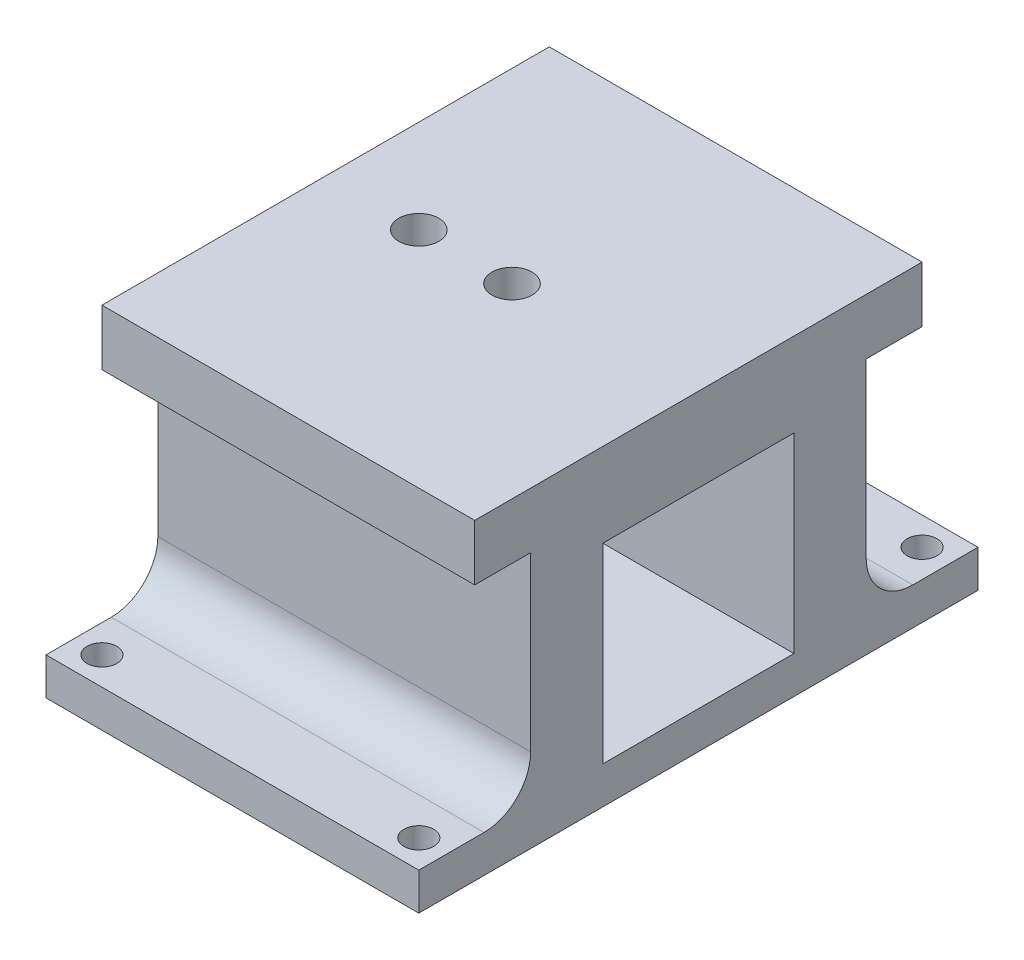
ISO-10303-21;
HEADER;
FILE_DESCRIPTION(('STEP AP214'),'2;1');
FILE_NAME('part.step','',(''),(''),'','','');
FILE_SCHEMA(('AUTOMOTIVE_DESIGN { 1 0 10303 214 1 1 1 1 }'));
ENDSEC;
DATA;
#1=APPLICATION_CONTEXT('core data for automotive mechanical design processes');
#2=APPLICATION_PROTOCOL_DEFINITION('international standard','automotive_design',2000,#1);
#3=PRODUCT_CONTEXT('',#1,'mechanical');
#4=PRODUCT('Part','Part','',(#3));
#5=PRODUCT_RELATED_PRODUCT_CATEGORY('part','',(#4));
#6=PRODUCT_DEFINITION_FORMATION('','',#4);
#7=PRODUCT_DEFINITION_CONTEXT('part definition',#1,'design');
#8=PRODUCT_DEFINITION('design','',#6,#7);
#9=PRODUCT_DEFINITION_SHAPE('','',#8);
#10=(LENGTH_UNIT() NAMED_UNIT(*) SI_UNIT(.MILLI.,.METRE.));
#11=(NAMED_UNIT(*) PLANE_ANGLE_UNIT() SI_UNIT($,.RADIAN.));
#12=(NAMED_UNIT(*) SI_UNIT($,.STERADIAN.) SOLID_ANGLE_UNIT());
#13=UNCERTAINTY_MEASURE_WITH_UNIT(LENGTH_MEASURE(1.E-05),#10,'distance_accuracy_value','');
#14=(GEOMETRIC_REPRESENTATION_CONTEXT(3) GLOBAL_UNCERTAINTY_ASSIGNED_CONTEXT((#13)) GLOBAL_UNIT_ASSIGNED_CONTEXT((#10,
#11,#12)) REPRESENTATION_CONTEXT('',''));
#15=CARTESIAN_POINT('',(0.,0.,0.));
#16=DIRECTION('',(0.,0.,1.));
#17=DIRECTION('',(1.,0.,0.));
#18=AXIS2_PLACEMENT_3D('',#15,#16,#17);
#19=CARTESIAN_POINT('',(0.,4.,0.));
#20=DIRECTION('',(0.,1.,0.));
#21=DIRECTION('',(0.,0.,1.));
#22=AXIS2_PLACEMENT_3D('',#19,#20,#21);
#23=PLANE('',#22);
#24=CARTESIAN_POINT('',(16.9999999999998,4.,-27.));
#25=DIRECTION('',(0.,1.,0.));
#26=DIRECTION('',(0.,0.,1.));
#27=AXIS2_PLACEMENT_3D('',#24,#25,#26);
#28=CIRCLE('',#27,1.60000000000001);
#29=CARTESIAN_POINT('',(16.9999999999998,4.,-25.4));
#30=VERTEX_POINT('',#29);
#31=EDGE_CURVE('E226',#30,#30,#28,.F.);
#32=ORIENTED_EDGE('',*,*,#31,.T.);
#33=EDGE_LOOP('',(#32));
#34=FACE_BOUND('',#33,.T.);
#35=DIRECTION('',(0.,0.,-1.));
#36=VECTOR('',#35,1.);
#37=CARTESIAN_POINT('',(-20.,4.,0.));
#38=LINE('',#37,#36);
#39=CARTESIAN_POINT('',(-20.,4.,-23.));
#40=VERTEX_POINT('',#39);
#41=CARTESIAN_POINT('',(-20.,4.,-30.));
#42=VERTEX_POINT('',#41);
#43=EDGE_CURVE('E375',#40,#42,#38,.T.);
#44=ORIENTED_EDGE('',*,*,#43,.F.);
#45=DIRECTION('',(-1.,0.,0.));
#46=VECTOR('',#45,1.);
#47=CARTESIAN_POINT('',(0.,4.,-23.));
#48=LINE('',#47,#46);
#49=CARTESIAN_POINT('',(20.,4.,-23.));
#50=VERTEX_POINT('',#49);
#51=EDGE_CURVE('E389',#40,#50,#48,.F.);
#52=ORIENTED_EDGE('',*,*,#51,.T.);
#53=DIRECTION('',(0.,0.,-1.));
#54=VECTOR('',#53,1.);
#55=CARTESIAN_POINT('',(20.,4.,0.));
#56=LINE('',#55,#54);
#57=CARTESIAN_POINT('',(20.,4.,-30.));
#58=VERTEX_POINT('',#57);
#59=EDGE_CURVE('E377',#50,#58,#56,.T.);
#60=ORIENTED_EDGE('',*,*,#59,.T.);
#61=DIRECTION('',(1.,0.,0.));
#62=VECTOR('',#61,1.);
#63=CARTESIAN_POINT('',(-20.,4.,-30.));
#64=LINE('',#63,#62);
#65=EDGE_CURVE('E258',#42,#58,#64,.T.);
#66=ORIENTED_EDGE('',*,*,#65,.F.);
#67=EDGE_LOOP('',(#44,#52,#60,#66));
#68=FACE_BOUND('',#67,.T.);
#69=CARTESIAN_POINT('',(-17.,4.,-27.));
#70=DIRECTION('',(0.,1.,0.));
#71=DIRECTION('',(0.,0.,1.));
#72=AXIS2_PLACEMENT_3D('',#69,#70,#71);
#73=CIRCLE('',#72,1.6);
#74=CARTESIAN_POINT('',(-17.,4.,-25.4));
#75=VERTEX_POINT('',#74);
#76=EDGE_CURVE('E239',#75,#75,#73,.T.);
#77=ORIENTED_EDGE('',*,*,#76,.F.);
#78=EDGE_LOOP('',(#77));
#79=FACE_BOUND('',#78,.T.);
#80=ADVANCED_FACE('F56',(#34,#68,#79),#23,.T.);
#81=CARTESIAN_POINT('',(-17.,4.,27.));
#82=DIRECTION('',(0.,1.,0.));
#83=DIRECTION('',(0.,0.,1.));
#84=AXIS2_PLACEMENT_3D('',#81,#82,#83);
#85=CIRCLE('',#84,1.6);
#86=CARTESIAN_POINT('',(-17.,4.,28.6));
#87=VERTEX_POINT('',#86);
#88=EDGE_CURVE('E222',#87,#87,#85,.F.);
#89=ORIENTED_EDGE('',*,*,#88,.T.);
#90=EDGE_LOOP('',(#89));
#91=FACE_BOUND('',#90,.T.);
#92=CARTESIAN_POINT('',(20.,4.,30.));
#93=VERTEX_POINT('',#92);
#94=CARTESIAN_POINT('',(20.,4.,23.));
#95=VERTEX_POINT('',#94);
#96=EDGE_CURVE('E372',#93,#95,#56,.T.);
#97=ORIENTED_EDGE('',*,*,#96,.T.);
#98=DIRECTION('',(1.,0.,0.));
#99=VECTOR('',#98,1.);
#100=CARTESIAN_POINT('',(0.,4.,23.));
#101=LINE('',#100,#99);
#102=CARTESIAN_POINT('',(-20.,4.,23.));
#103=VERTEX_POINT('',#102);
#104=EDGE_CURVE('E78',#95,#103,#101,.F.);
#105=ORIENTED_EDGE('',*,*,#104,.T.);
#106=CARTESIAN_POINT('',(-20.,4.,30.));
#107=VERTEX_POINT('',#106);
#108=EDGE_CURVE('E358',#107,#103,#38,.T.);
#109=ORIENTED_EDGE('',*,*,#108,.F.);
#110=DIRECTION('',(-1.,0.,0.));
#111=VECTOR('',#110,1.);
#112=CARTESIAN_POINT('',(-20.,4.,30.));
#113=LINE('',#112,#111);
#114=EDGE_CURVE('E254',#93,#107,#113,.T.);
#115=ORIENTED_EDGE('',*,*,#114,.F.);
#116=EDGE_LOOP('',(#97,#105,#109,#115));
#117=FACE_BOUND('',#116,.T.);
#118=CARTESIAN_POINT('',(16.9999999999998,4.,27.));
#119=DIRECTION('',(0.,1.,0.));
#120=DIRECTION('',(0.,0.,1.));
#121=AXIS2_PLACEMENT_3D('',#118,#119,#120);
#122=CIRCLE('',#121,1.60000000000001);
#123=CARTESIAN_POINT('',(16.9999999999998,4.,28.6));
#124=VERTEX_POINT('',#123);
#125=EDGE_CURVE('E231',#124,#124,#122,.T.);
#126=ORIENTED_EDGE('',*,*,#125,.F.);
#127=EDGE_LOOP('',(#126));
#128=FACE_BOUND('',#127,.T.);
#129=ADVANCED_FACE('F446',(#91,#117,#128),#23,.T.);
#130=CARTESIAN_POINT('',(0.,0.,0.));
#131=DIRECTION('',(0.,1.,0.));
#132=DIRECTION('',(0.,0.,1.));
#133=AXIS2_PLACEMENT_3D('',#130,#131,#132);
#134=PLANE('',#133);
#135=CARTESIAN_POINT('',(0.,0.,0.));
#136=DIRECTION('',(0.,1.,0.));
#137=DIRECTION('',(0.,0.,1.));
#138=AXIS2_PLACEMENT_3D('',#135,#136,#137);
#139=CIRCLE('',#138,2.15);
#140=CARTESIAN_POINT('',(0.,0.,2.15));
#141=VERTEX_POINT('',#140);
#142=EDGE_CURVE('E580',#141,#141,#139,.T.);
#143=ORIENTED_EDGE('',*,*,#142,.T.);
#144=EDGE_LOOP('',(#143));
#145=FACE_BOUND('',#144,.T.);
#146=CARTESIAN_POINT('',(-10.,0.,0.));
#147=DIRECTION('',(0.,1.,0.));
#148=DIRECTION('',(0.,0.,1.));
#149=AXIS2_PLACEMENT_3D('',#146,#147,#148);
#150=CIRCLE('',#149,2.15);
#151=CARTESIAN_POINT('',(-10.,0.,2.15));
#152=VERTEX_POINT('',#151);
#153=EDGE_CURVE('E581',#152,#152,#150,.T.);
#154=ORIENTED_EDGE('',*,*,#153,.T.);
#155=EDGE_LOOP('',(#154));
#156=FACE_BOUND('',#155,.T.);
#157=CARTESIAN_POINT('',(16.9999999999998,0.,27.));
#158=DIRECTION('',(0.,1.,0.));
#159=DIRECTION('',(0.,0.,1.));
#160=AXIS2_PLACEMENT_3D('',#157,#158,#159);
#161=CIRCLE('',#160,1.60000000000001);
#162=CARTESIAN_POINT('',(16.9999999999998,0.,28.6));
#163=VERTEX_POINT('',#162);
#164=EDGE_CURVE('E235',#163,#163,#161,.T.);
#165=ORIENTED_EDGE('',*,*,#164,.T.);
#166=EDGE_LOOP('',(#165));
#167=FACE_BOUND('',#166,.T.);
#168=CARTESIAN_POINT('',(-17.,0.,27.));
#169=DIRECTION('',(0.,1.,0.));
#170=DIRECTION('',(0.,0.,1.));
#171=AXIS2_PLACEMENT_3D('',#168,#169,#170);
#172=CIRCLE('',#171,1.6);
#173=CARTESIAN_POINT('',(-17.,0.,28.6));
#174=VERTEX_POINT('',#173);
#175=EDGE_CURVE('E227',#174,#174,#172,.F.);
#176=ORIENTED_EDGE('',*,*,#175,.F.);
#177=EDGE_LOOP('',(#176));
#178=FACE_BOUND('',#177,.T.);
#179=CARTESIAN_POINT('',(16.9999999999998,0.,-27.));
#180=DIRECTION('',(0.,1.,0.));
#181=DIRECTION('',(0.,0.,1.));
#182=AXIS2_PLACEMENT_3D('',#179,#180,#181);
#183=CIRCLE('',#182,1.60000000000001);
#184=CARTESIAN_POINT('',(16.9999999999998,0.,-25.4));
#185=VERTEX_POINT('',#184);
#186=EDGE_CURVE('E246',#185,#185,#183,.F.);
#187=ORIENTED_EDGE('',*,*,#186,.F.);
#188=EDGE_LOOP('',(#187));
#189=FACE_BOUND('',#188,.T.);
#190=DIRECTION('',(0.,0.,-1.));
#191=VECTOR('',#190,1.);
#192=CARTESIAN_POINT('',(20.,0.,0.));
#193=LINE('',#192,#191);
#194=CARTESIAN_POINT('',(20.,0.,30.));
#195=VERTEX_POINT('',#194);
#196=CARTESIAN_POINT('',(20.,0.,-30.));
#197=VERTEX_POINT('',#196);
#198=EDGE_CURVE('E351',#195,#197,#193,.T.);
#199=ORIENTED_EDGE('',*,*,#198,.F.);
#200=DIRECTION('',(-1.,0.,0.));
#201=VECTOR('',#200,1.);
#202=CARTESIAN_POINT('',(-20.,0.,30.));
#203=LINE('',#202,#201);
#204=CARTESIAN_POINT('',(-20.,0.,30.));
#205=VERTEX_POINT('',#204);
#206=EDGE_CURVE('E250',#195,#205,#203,.T.);
#207=ORIENTED_EDGE('',*,*,#206,.T.);
#208=DIRECTION('',(0.,0.,-1.));
#209=VECTOR('',#208,1.);
#210=CARTESIAN_POINT('',(-20.,0.,0.));
#211=LINE('',#210,#209);
#212=CARTESIAN_POINT('',(-20.,0.,-30.));
#213=VERTEX_POINT('',#212);
#214=EDGE_CURVE('E383',#205,#213,#211,.T.);
#215=ORIENTED_EDGE('',*,*,#214,.T.);
#216=DIRECTION('',(1.,0.,0.));
#217=VECTOR('',#216,1.);
#218=CARTESIAN_POINT('',(-20.,0.,-30.));
#219=LINE('',#218,#217);
#220=EDGE_CURVE('E259',#213,#197,#219,.T.);
#221=ORIENTED_EDGE('',*,*,#220,.T.);
#222=EDGE_LOOP('',(#199,#207,#215,#221));
#223=FACE_BOUND('',#222,.T.);
#224=CARTESIAN_POINT('',(-17.,0.,-27.));
#225=DIRECTION('',(0.,1.,0.));
#226=DIRECTION('',(0.,0.,1.));
#227=AXIS2_PLACEMENT_3D('',#224,#225,#226);
#228=CIRCLE('',#227,1.6);
#229=CARTESIAN_POINT('',(-17.,0.,-25.4));
#230=VERTEX_POINT('',#229);
#231=EDGE_CURVE('E221',#230,#230,#228,.T.);
#232=ORIENTED_EDGE('',*,*,#231,.T.);
#233=EDGE_LOOP('',(#232));
#234=FACE_BOUND('',#233,.T.);
#235=ADVANCED_FACE('F438',(#145,#156,#167,#178,#189,#223,#234),#134,.F.);
#236=CARTESIAN_POINT('',(0.,9.,-23.));
#237=DIRECTION('',(1.,0.,0.));
#238=DIRECTION('',(0.,0.,-1.));
#239=AXIS2_PLACEMENT_3D('',#236,#237,#238);
#240=CYLINDRICAL_SURFACE('',#239,5.);
#241=DIRECTION('',(-1.,0.,0.));
#242=VECTOR('',#241,1.);
#243=CARTESIAN_POINT('',(0.,9.,-18.));
#244=LINE('',#243,#242);
#245=CARTESIAN_POINT('',(20.,9.,-18.));
#246=VERTEX_POINT('',#245);
#247=CARTESIAN_POINT('',(-20.,9.,-18.));
#248=VERTEX_POINT('',#247);
#249=EDGE_CURVE('E334',#246,#248,#244,.T.);
#250=ORIENTED_EDGE('',*,*,#249,.F.);
#251=CARTESIAN_POINT('',(20.,9.,-23.));
#252=DIRECTION('',(-1.,0.,0.));
#253=DIRECTION('',(0.,0.,1.));
#254=AXIS2_PLACEMENT_3D('',#251,#252,#253);
#255=CIRCLE('',#254,5.);
#256=EDGE_CURVE('E393',#246,#50,#255,.F.);
#257=ORIENTED_EDGE('',*,*,#256,.T.);
#258=ORIENTED_EDGE('',*,*,#51,.F.);
#259=CARTESIAN_POINT('',(-20.,9.,-23.));
#260=DIRECTION('',(-1.,0.,0.));
#261=DIRECTION('',(0.,0.,1.));
#262=AXIS2_PLACEMENT_3D('',#259,#260,#261);
#263=CIRCLE('',#262,5.);
#264=EDGE_CURVE('E396',#40,#248,#263,.T.);
#265=ORIENTED_EDGE('',*,*,#264,.T.);
#266=EDGE_LOOP('',(#250,#257,#258,#265));
#267=FACE_BOUND('',#266,.T.);
#268=ADVANCED_FACE('F426',(#267),#240,.F.);
#269=CARTESIAN_POINT('',(0.,4.,0.));
#270=DIRECTION('',(0.,1.,0.));
#271=DIRECTION('',(0.,0.,1.));
#272=AXIS2_PLACEMENT_3D('',#269,#270,#271);
#273=CIRCLE('',#272,2.15);
#274=CARTESIAN_POINT('',(0.,4.,2.15));
#275=VERTEX_POINT('',#274);
#276=EDGE_CURVE('E209',#275,#275,#273,.T.);
#277=ORIENTED_EDGE('',*,*,#276,.F.);
#278=EDGE_LOOP('',(#277));
#279=FACE_BOUND('',#278,.T.);
#280=CARTESIAN_POINT('',(-10.,4.,0.));
#281=DIRECTION('',(0.,1.,0.));
#282=DIRECTION('',(0.,0.,1.));
#283=AXIS2_PLACEMENT_3D('',#280,#281,#282);
#284=CIRCLE('',#283,2.15);
#285=CARTESIAN_POINT('',(-10.,4.,2.15));
#286=VERTEX_POINT('',#285);
#287=EDGE_CURVE('E493',#286,#286,#284,.T.);
#288=ORIENTED_EDGE('',*,*,#287,.F.);
#289=EDGE_LOOP('',(#288));
#290=FACE_BOUND('',#289,.T.);
#291=DIRECTION('',(1.,0.,0.));
#292=VECTOR('',#291,1.);
#293=CARTESIAN_POINT('',(0.,4.,-10.25));
#294=LINE('',#293,#292);
#295=CARTESIAN_POINT('',(-20.,4.,-10.25));
#296=VERTEX_POINT('',#295);
#297=CARTESIAN_POINT('',(20.,4.,-10.25));
#298=VERTEX_POINT('',#297);
#299=EDGE_CURVE('E330',#296,#298,#294,.T.);
#300=ORIENTED_EDGE('',*,*,#299,.F.);
#301=CARTESIAN_POINT('',(-20.,4.,10.25));
#302=VERTEX_POINT('',#301);
#303=EDGE_CURVE('E380',#302,#296,#38,.T.);
#304=ORIENTED_EDGE('',*,*,#303,.F.);
#305=DIRECTION('',(1.,0.,0.));
#306=VECTOR('',#305,1.);
#307=CARTESIAN_POINT('',(0.,4.,10.25));
#308=LINE('',#307,#306);
#309=CARTESIAN_POINT('',(20.,4.,10.25));
#310=VERTEX_POINT('',#309);
#311=EDGE_CURVE('E335',#302,#310,#308,.T.);
#312=ORIENTED_EDGE('',*,*,#311,.T.);
#313=EDGE_CURVE('E376',#310,#298,#56,.T.);
#314=ORIENTED_EDGE('',*,*,#313,.T.);
#315=EDGE_LOOP('',(#300,#304,#312,#314));
#316=FACE_BOUND('',#315,.T.);
#317=ADVANCED_FACE('F470',(#279,#290,#316),#23,.T.);
#318=CARTESIAN_POINT('',(20.,4.,0.));
#319=DIRECTION('',(-1.,0.,0.));
#320=DIRECTION('',(0.,0.,1.));
#321=AXIS2_PLACEMENT_3D('',#318,#319,#320);
#322=PLANE('',#321);
#323=ORIENTED_EDGE('',*,*,#313,.F.);
#324=DIRECTION('',(0.,-1.,0.));
#325=VECTOR('',#324,1.);
#326=CARTESIAN_POINT('',(20.,24.5,10.25));
#327=LINE('',#326,#325);
#328=CARTESIAN_POINT('',(20.,24.5,10.25));
#329=VERTEX_POINT('',#328);
#330=EDGE_CURVE('E362',#329,#310,#327,.T.);
#331=ORIENTED_EDGE('',*,*,#330,.F.);
#332=DIRECTION('',(0.,0.,-1.));
#333=VECTOR('',#332,1.);
#334=CARTESIAN_POINT('',(20.,24.5,-18.));
#335=LINE('',#334,#333);
#336=CARTESIAN_POINT('',(20.,24.5,-10.25));
#337=VERTEX_POINT('',#336);
#338=EDGE_CURVE('E314',#329,#337,#335,.T.);
#339=ORIENTED_EDGE('',*,*,#338,.T.);
#340=DIRECTION('',(0.,-1.,0.));
#341=VECTOR('',#340,1.);
#342=CARTESIAN_POINT('',(20.,24.5,-10.25));
#343=LINE('',#342,#341);
#344=EDGE_CURVE('E339',#337,#298,#343,.T.);
#345=ORIENTED_EDGE('',*,*,#344,.T.);
#346=EDGE_LOOP('',(#323,#331,#339,#345));
#347=FACE_BOUND('',#346,.T.);
#348=CARTESIAN_POINT('',(20.,9.,23.));
#349=DIRECTION('',(-1.,0.,0.));
#350=DIRECTION('',(0.,0.,1.));
#351=AXIS2_PLACEMENT_3D('',#348,#349,#350);
#352=CIRCLE('',#351,5.);
#353=CARTESIAN_POINT('',(20.,9.,18.));
#354=VERTEX_POINT('',#353);
#355=EDGE_CURVE('E65',#354,#95,#352,.T.);
#356=ORIENTED_EDGE('',*,*,#355,.T.);
#357=ORIENTED_EDGE('',*,*,#96,.F.);
#358=DIRECTION('',(0.,-1.,0.));
#359=VECTOR('',#358,1.);
#360=CARTESIAN_POINT('',(20.,4.,30.));
#361=LINE('',#360,#359);
#362=EDGE_CURVE('E263',#93,#195,#361,.T.);
#363=ORIENTED_EDGE('',*,*,#362,.T.);
#364=ORIENTED_EDGE('',*,*,#198,.T.);
#365=DIRECTION('',(0.,-1.,0.));
#366=VECTOR('',#365,1.);
#367=CARTESIAN_POINT('',(20.,4.,-30.));
#368=LINE('',#367,#366);
#369=EDGE_CURVE('E270',#58,#197,#368,.T.);
#370=ORIENTED_EDGE('',*,*,#369,.F.);
#371=ORIENTED_EDGE('',*,*,#59,.F.);
#372=ORIENTED_EDGE('',*,*,#256,.F.);
#373=DIRECTION('',(0.,-1.,0.));
#374=VECTOR('',#373,1.);
#375=CARTESIAN_POINT('',(20.,24.5,-18.));
#376=LINE('',#375,#374);
#377=CARTESIAN_POINT('',(20.,27.5,-18.));
#378=VERTEX_POINT('',#377);
#379=EDGE_CURVE('E328',#378,#246,#376,.T.);
#380=ORIENTED_EDGE('',*,*,#379,.F.);
#381=DIRECTION('',(0.,0.,-1.));
#382=VECTOR('',#381,1.);
#383=CARTESIAN_POINT('',(20.,27.5,-24.));
#384=LINE('',#383,#382);
#385=CARTESIAN_POINT('',(20.,27.5,-24.));
#386=VERTEX_POINT('',#385);
#387=EDGE_CURVE('E292',#378,#386,#384,.T.);
#388=ORIENTED_EDGE('',*,*,#387,.T.);
#389=DIRECTION('',(0.,-1.,0.));
#390=VECTOR('',#389,1.);
#391=CARTESIAN_POINT('',(20.,31.5,-24.));
#392=LINE('',#391,#390);
#393=CARTESIAN_POINT('',(20.,33.5,-24.));
#394=VERTEX_POINT('',#393);
#395=EDGE_CURVE('E303',#394,#386,#392,.T.);
#396=ORIENTED_EDGE('',*,*,#395,.F.);
#397=DIRECTION('',(0.,0.,-1.));
#398=VECTOR('',#397,1.);
#399=CARTESIAN_POINT('',(20.,33.5,-24.));
#400=LINE('',#399,#398);
#401=CARTESIAN_POINT('',(20.,33.5,24.));
#402=VERTEX_POINT('',#401);
#403=EDGE_CURVE('E202',#402,#394,#400,.T.);
#404=ORIENTED_EDGE('',*,*,#403,.F.);
#405=DIRECTION('',(0.,-1.,0.));
#406=VECTOR('',#405,1.);
#407=CARTESIAN_POINT('',(20.,31.5,24.));
#408=LINE('',#407,#406);
#409=CARTESIAN_POINT('',(20.,27.5,24.));
#410=VERTEX_POINT('',#409);
#411=EDGE_CURVE('E192',#402,#410,#408,.T.);
#412=ORIENTED_EDGE('',*,*,#411,.T.);
#413=CARTESIAN_POINT('',(20.,27.5,18.));
#414=VERTEX_POINT('',#413);
#415=EDGE_CURVE('E293',#410,#414,#384,.T.);
#416=ORIENTED_EDGE('',*,*,#415,.T.);
#417=DIRECTION('',(0.,-1.,0.));
#418=VECTOR('',#417,1.);
#419=CARTESIAN_POINT('',(20.,24.5,18.));
#420=LINE('',#419,#418);
#421=EDGE_CURVE('E366',#414,#354,#420,.T.);
#422=ORIENTED_EDGE('',*,*,#421,.T.);
#423=EDGE_LOOP('',(#356,#357,#363,#364,#370,#371,#372,#380,#388,#396,#404,#412,#416,#422));
#424=FACE_BOUND('',#423,.T.);
#425=ADVANCED_FACE('F413',(#347,#424),#322,.F.);
#426=CARTESIAN_POINT('',(-20.,4.,0.));
#427=DIRECTION('',(-1.,0.,0.));
#428=DIRECTION('',(0.,0.,1.));
#429=AXIS2_PLACEMENT_3D('',#426,#427,#428);
#430=PLANE('',#429);
#431=DIRECTION('',(0.,-1.,0.));
#432=VECTOR('',#431,1.);
#433=CARTESIAN_POINT('',(-20.,24.5,10.25));
#434=LINE('',#433,#432);
#435=CARTESIAN_POINT('',(-20.,24.5,10.25));
#436=VERTEX_POINT('',#435);
#437=EDGE_CURVE('E355',#436,#302,#434,.T.);
#438=ORIENTED_EDGE('',*,*,#437,.T.);
#439=ORIENTED_EDGE('',*,*,#303,.T.);
#440=DIRECTION('',(0.,-1.,0.));
#441=VECTOR('',#440,1.);
#442=CARTESIAN_POINT('',(-20.,24.5,-10.25));
#443=LINE('',#442,#441);
#444=CARTESIAN_POINT('',(-20.,24.5,-10.25));
#445=VERTEX_POINT('',#444);
#446=EDGE_CURVE('E343',#445,#296,#443,.T.);
#447=ORIENTED_EDGE('',*,*,#446,.F.);
#448=DIRECTION('',(0.,0.,1.));
#449=VECTOR('',#448,1.);
#450=CARTESIAN_POINT('',(-20.,24.5,-18.));
#451=LINE('',#450,#449);
#452=EDGE_CURVE('E191',#445,#436,#451,.T.);
#453=ORIENTED_EDGE('',*,*,#452,.T.);
#454=EDGE_LOOP('',(#438,#439,#447,#453));
#455=FACE_BOUND('',#454,.T.);
#456=ORIENTED_EDGE('',*,*,#108,.T.);
#457=CARTESIAN_POINT('',(-20.,9.,23.));
#458=DIRECTION('',(-1.,0.,0.));
#459=DIRECTION('',(0.,0.,1.));
#460=AXIS2_PLACEMENT_3D('',#457,#458,#459);
#461=CIRCLE('',#460,5.);
#462=CARTESIAN_POINT('',(-20.,9.,18.));
#463=VERTEX_POINT('',#462);
#464=EDGE_CURVE('E12',#103,#463,#461,.F.);
#465=ORIENTED_EDGE('',*,*,#464,.T.);
#466=DIRECTION('',(0.,-1.,0.));
#467=VECTOR('',#466,1.);
#468=CARTESIAN_POINT('',(-20.,24.5,18.));
#469=LINE('',#468,#467);
#470=CARTESIAN_POINT('',(-20.,27.5,18.));
#471=VERTEX_POINT('',#470);
#472=EDGE_CURVE('E329',#471,#463,#469,.T.);
#473=ORIENTED_EDGE('',*,*,#472,.F.);
#474=DIRECTION('',(0.,0.,1.));
#475=VECTOR('',#474,1.);
#476=CARTESIAN_POINT('',(-20.,27.5,-24.));
#477=LINE('',#476,#475);
#478=CARTESIAN_POINT('',(-20.,27.5,24.));
#479=VERTEX_POINT('',#478);
#480=EDGE_CURVE('E187',#471,#479,#477,.T.);
#481=ORIENTED_EDGE('',*,*,#480,.T.);
#482=DIRECTION('',(0.,-1.,0.));
#483=VECTOR('',#482,1.);
#484=CARTESIAN_POINT('',(-20.,31.5,24.));
#485=LINE('',#484,#483);
#486=CARTESIAN_POINT('',(-20.,33.5,24.));
#487=VERTEX_POINT('',#486);
#488=EDGE_CURVE('E180',#487,#479,#485,.T.);
#489=ORIENTED_EDGE('',*,*,#488,.F.);
#490=DIRECTION('',(0.,0.,1.));
#491=VECTOR('',#490,1.);
#492=CARTESIAN_POINT('',(-20.,33.5,-24.));
#493=LINE('',#492,#491);
#494=CARTESIAN_POINT('',(-20.,33.5,-24.));
#495=VERTEX_POINT('',#494);
#496=EDGE_CURVE('E185',#495,#487,#493,.T.);
#497=ORIENTED_EDGE('',*,*,#496,.F.);
#498=DIRECTION('',(0.,-1.,0.));
#499=VECTOR('',#498,1.);
#500=CARTESIAN_POINT('',(-20.,31.5,-24.));
#501=LINE('',#500,#499);
#502=CARTESIAN_POINT('',(-20.,27.5,-24.));
#503=VERTEX_POINT('',#502);
#504=EDGE_CURVE('E300',#495,#503,#501,.T.);
#505=ORIENTED_EDGE('',*,*,#504,.T.);
#506=CARTESIAN_POINT('',(-20.,27.5,-18.));
#507=VERTEX_POINT('',#506);
#508=EDGE_CURVE('E285',#503,#507,#477,.T.);
#509=ORIENTED_EDGE('',*,*,#508,.T.);
#510=DIRECTION('',(0.,-1.,0.));
#511=VECTOR('',#510,1.);
#512=CARTESIAN_POINT('',(-20.,24.5,-18.));
#513=LINE('',#512,#511);
#514=EDGE_CURVE('E347',#507,#248,#513,.T.);
#515=ORIENTED_EDGE('',*,*,#514,.T.);
#516=ORIENTED_EDGE('',*,*,#264,.F.);
#517=ORIENTED_EDGE('',*,*,#43,.T.);
#518=DIRECTION('',(0.,-1.,0.));
#519=VECTOR('',#518,1.);
#520=CARTESIAN_POINT('',(-20.,4.,-30.));
#521=LINE('',#520,#519);
#522=EDGE_CURVE('E274',#42,#213,#521,.T.);
#523=ORIENTED_EDGE('',*,*,#522,.T.);
#524=ORIENTED_EDGE('',*,*,#214,.F.);
#525=DIRECTION('',(0.,-1.,0.));
#526=VECTOR('',#525,1.);
#527=CARTESIAN_POINT('',(-20.,4.,30.));
#528=LINE('',#527,#526);
#529=EDGE_CURVE('E278',#107,#205,#528,.T.);
#530=ORIENTED_EDGE('',*,*,#529,.F.);
#531=EDGE_LOOP('',(#456,#465,#473,#481,#489,#497,#505,#509,#515,#516,#517,#523,#524,#530));
#532=FACE_BOUND('',#531,.T.);
#533=ADVANCED_FACE('F182',(#455,#532),#430,.T.);
#534=CARTESIAN_POINT('',(0.,24.5,10.25));
#535=DIRECTION('',(0.,0.,-1.));
#536=DIRECTION('',(-1.,0.,0.));
#537=AXIS2_PLACEMENT_3D('',#534,#535,#536);
#538=PLANE('',#537);
#539=ORIENTED_EDGE('',*,*,#311,.F.);
#540=ORIENTED_EDGE('',*,*,#437,.F.);
#541=DIRECTION('',(1.,0.,0.));
#542=VECTOR('',#541,1.);
#543=CARTESIAN_POINT('',(0.,24.5,10.25));
#544=LINE('',#543,#542);
#545=EDGE_CURVE('E318',#436,#329,#544,.T.);
#546=ORIENTED_EDGE('',*,*,#545,.T.);
#547=ORIENTED_EDGE('',*,*,#330,.T.);
#548=EDGE_LOOP('',(#539,#540,#546,#547));
#549=FACE_BOUND('',#548,.T.);
#550=ADVANCED_FACE('F506',(#549),#538,.T.);
#551=CARTESIAN_POINT('',(0.,24.5,18.));
#552=DIRECTION('',(0.,0.,-1.));
#553=DIRECTION('',(-1.,0.,0.));
#554=AXIS2_PLACEMENT_3D('',#551,#552,#553);
#555=PLANE('',#554);
#556=ORIENTED_EDGE('',*,*,#472,.T.);
#557=DIRECTION('',(1.,0.,0.));
#558=VECTOR('',#557,1.);
#559=CARTESIAN_POINT('',(0.,9.,18.));
#560=LINE('',#559,#558);
#561=EDGE_CURVE('E399',#463,#354,#560,.T.);
#562=ORIENTED_EDGE('',*,*,#561,.T.);
#563=ORIENTED_EDGE('',*,*,#421,.F.);
#564=DIRECTION('',(1.,0.,0.));
#565=VECTOR('',#564,1.);
#566=CARTESIAN_POINT('',(-20.,27.5,18.));
#567=LINE('',#566,#565);
#568=EDGE_CURVE('E309',#471,#414,#567,.T.);
#569=ORIENTED_EDGE('',*,*,#568,.F.);
#570=EDGE_LOOP('',(#556,#562,#563,#569));
#571=FACE_BOUND('',#570,.T.);
#572=ADVANCED_FACE('F452',(#571),#555,.F.);
#573=CARTESIAN_POINT('',(0.,24.5,-10.25));
#574=DIRECTION('',(0.,0.,-1.));
#575=DIRECTION('',(-1.,0.,0.));
#576=AXIS2_PLACEMENT_3D('',#573,#574,#575);
#577=PLANE('',#576);
#578=ORIENTED_EDGE('',*,*,#446,.T.);
#579=ORIENTED_EDGE('',*,*,#299,.T.);
#580=ORIENTED_EDGE('',*,*,#344,.F.);
#581=DIRECTION('',(1.,0.,0.));
#582=VECTOR('',#581,1.);
#583=CARTESIAN_POINT('',(0.,24.5,-10.25));
#584=LINE('',#583,#582);
#585=EDGE_CURVE('E325',#445,#337,#584,.T.);
#586=ORIENTED_EDGE('',*,*,#585,.F.);
#587=EDGE_LOOP('',(#578,#579,#580,#586));
#588=FACE_BOUND('',#587,.T.);
#589=ADVANCED_FACE('F501',(#588),#577,.F.);
#590=CARTESIAN_POINT('',(0.,24.5,-18.));
#591=DIRECTION('',(0.,0.,-1.));
#592=DIRECTION('',(-1.,0.,0.));
#593=AXIS2_PLACEMENT_3D('',#590,#591,#592);
#594=PLANE('',#593);
#595=ORIENTED_EDGE('',*,*,#379,.T.);
#596=ORIENTED_EDGE('',*,*,#249,.T.);
#597=ORIENTED_EDGE('',*,*,#514,.F.);
#598=DIRECTION('',(-1.,0.,0.));
#599=VECTOR('',#598,1.);
#600=CARTESIAN_POINT('',(-20.,27.5,-18.));
#601=LINE('',#600,#599);
#602=EDGE_CURVE('E313',#378,#507,#601,.T.);
#603=ORIENTED_EDGE('',*,*,#602,.F.);
#604=EDGE_LOOP('',(#595,#596,#597,#603));
#605=FACE_BOUND('',#604,.T.);
#606=ADVANCED_FACE('F423',(#605),#594,.T.);
#607=CARTESIAN_POINT('',(0.,24.5,0.));
#608=DIRECTION('',(0.,1.,0.));
#609=DIRECTION('',(0.,0.,1.));
#610=AXIS2_PLACEMENT_3D('',#607,#608,#609);
#611=PLANE('',#610);
#612=CARTESIAN_POINT('',(0.,24.5,0.));
#613=DIRECTION('',(0.,1.,0.));
#614=DIRECTION('',(0.,0.,1.));
#615=AXIS2_PLACEMENT_3D('',#612,#613,#614);
#616=CIRCLE('',#615,2.15);
#617=CARTESIAN_POINT('',(0.,24.5,2.15));
#618=VERTEX_POINT('',#617);
#619=EDGE_CURVE('E213',#618,#618,#616,.T.);
#620=ORIENTED_EDGE('',*,*,#619,.T.);
#621=EDGE_LOOP('',(#620));
#622=FACE_BOUND('',#621,.T.);
#623=CARTESIAN_POINT('',(-10.,24.5,0.));
#624=DIRECTION('',(0.,1.,0.));
#625=DIRECTION('',(0.,0.,1.));
#626=AXIS2_PLACEMENT_3D('',#623,#624,#625);
#627=CIRCLE('',#626,2.15);
#628=CARTESIAN_POINT('',(-10.,24.5,2.15));
#629=VERTEX_POINT('',#628);
#630=EDGE_CURVE('E574',#629,#629,#627,.T.);
#631=ORIENTED_EDGE('',*,*,#630,.T.);
#632=EDGE_LOOP('',(#631));
#633=FACE_BOUND('',#632,.T.);
#634=ORIENTED_EDGE('',*,*,#545,.F.);
#635=ORIENTED_EDGE('',*,*,#452,.F.);
#636=ORIENTED_EDGE('',*,*,#585,.T.);
#637=ORIENTED_EDGE('',*,*,#338,.F.);
#638=EDGE_LOOP('',(#634,#635,#636,#637));
#639=FACE_BOUND('',#638,.T.);
#640=ADVANCED_FACE('F464',(#622,#633,#639),#611,.F.);
#641=CARTESIAN_POINT('',(0.,9.,23.));
#642=DIRECTION('',(1.,0.,0.));
#643=DIRECTION('',(0.,0.,-1.));
#644=AXIS2_PLACEMENT_3D('',#641,#642,#643);
#645=CYLINDRICAL_SURFACE('',#644,5.);
#646=ORIENTED_EDGE('',*,*,#464,.F.);
#647=ORIENTED_EDGE('',*,*,#104,.F.);
#648=ORIENTED_EDGE('',*,*,#355,.F.);
#649=ORIENTED_EDGE('',*,*,#561,.F.);
#650=EDGE_LOOP('',(#646,#647,#648,#649));
#651=FACE_BOUND('',#650,.T.);
#652=ADVANCED_FACE('F58',(#651),#645,.F.);
#653=CARTESIAN_POINT('',(0.,27.5,0.));
#654=DIRECTION('',(0.,1.,0.));
#655=DIRECTION('',(0.,0.,1.));
#656=AXIS2_PLACEMENT_3D('',#653,#654,#655);
#657=PLANE('',#656);
#658=ORIENTED_EDGE('',*,*,#480,.F.);
#659=ORIENTED_EDGE('',*,*,#568,.T.);
#660=ORIENTED_EDGE('',*,*,#415,.F.);
#661=DIRECTION('',(1.,0.,0.));
#662=VECTOR('',#661,1.);
#663=CARTESIAN_POINT('',(-20.,27.5,24.));
#664=LINE('',#663,#662);
#665=EDGE_CURVE('E289',#479,#410,#664,.T.);
#666=ORIENTED_EDGE('',*,*,#665,.F.);
#667=EDGE_LOOP('',(#658,#659,#660,#666));
#668=FACE_BOUND('',#667,.T.);
#669=ADVANCED_FACE('F456',(#668),#657,.F.);
#670=ORIENTED_EDGE('',*,*,#387,.F.);
#671=ORIENTED_EDGE('',*,*,#602,.T.);
#672=ORIENTED_EDGE('',*,*,#508,.F.);
#673=DIRECTION('',(-1.,0.,0.));
#674=VECTOR('',#673,1.);
#675=CARTESIAN_POINT('',(-20.,27.5,-24.));
#676=LINE('',#675,#674);
#677=EDGE_CURVE('E297',#386,#503,#676,.T.);
#678=ORIENTED_EDGE('',*,*,#677,.F.);
#679=EDGE_LOOP('',(#670,#671,#672,#678));
#680=FACE_BOUND('',#679,.T.);
#681=ADVANCED_FACE('F420',(#680),#657,.F.);
#682=CARTESIAN_POINT('',(-20.,31.5,24.));
#683=DIRECTION('',(0.,0.,-1.));
#684=DIRECTION('',(-1.,0.,0.));
#685=AXIS2_PLACEMENT_3D('',#682,#683,#684);
#686=PLANE('',#685);
#687=ORIENTED_EDGE('',*,*,#665,.T.);
#688=ORIENTED_EDGE('',*,*,#411,.F.);
#689=DIRECTION('',(1.,0.,0.));
#690=VECTOR('',#689,1.);
#691=CARTESIAN_POINT('',(-20.,33.5,24.));
#692=LINE('',#691,#690);
#693=EDGE_CURVE('E195',#487,#402,#692,.T.);
#694=ORIENTED_EDGE('',*,*,#693,.F.);
#695=ORIENTED_EDGE('',*,*,#488,.T.);
#696=EDGE_LOOP('',(#687,#688,#694,#695));
#697=FACE_BOUND('',#696,.T.);
#698=ADVANCED_FACE('F196',(#697),#686,.F.);
#699=CARTESIAN_POINT('',(-20.,31.5,-24.));
#700=DIRECTION('',(0.,0.,1.));
#701=DIRECTION('',(1.,0.,0.));
#702=AXIS2_PLACEMENT_3D('',#699,#700,#701);
#703=PLANE('',#702);
#704=ORIENTED_EDGE('',*,*,#677,.T.);
#705=ORIENTED_EDGE('',*,*,#504,.F.);
#706=DIRECTION('',(-1.,0.,0.));
#707=VECTOR('',#706,1.);
#708=CARTESIAN_POINT('',(-20.,33.5,-24.));
#709=LINE('',#708,#707);
#710=EDGE_CURVE('E207',#394,#495,#709,.T.);
#711=ORIENTED_EDGE('',*,*,#710,.F.);
#712=ORIENTED_EDGE('',*,*,#395,.T.);
#713=EDGE_LOOP('',(#704,#705,#711,#712));
#714=FACE_BOUND('',#713,.T.);
#715=ADVANCED_FACE('F418',(#714),#703,.F.);
#716=CARTESIAN_POINT('',(-20.,4.,-30.));
#717=DIRECTION('',(0.,0.,-1.));
#718=DIRECTION('',(-1.,0.,0.));
#719=AXIS2_PLACEMENT_3D('',#716,#717,#718);
#720=PLANE('',#719);
#721=ORIENTED_EDGE('',*,*,#220,.F.);
#722=ORIENTED_EDGE('',*,*,#522,.F.);
#723=ORIENTED_EDGE('',*,*,#65,.T.);
#724=ORIENTED_EDGE('',*,*,#369,.T.);
#725=EDGE_LOOP('',(#721,#722,#723,#724));
#726=FACE_BOUND('',#725,.T.);
#727=ADVANCED_FACE('F435',(#726),#720,.T.);
#728=CARTESIAN_POINT('',(-20.,4.,30.));
#729=DIRECTION('',(0.,0.,1.));
#730=DIRECTION('',(1.,0.,0.));
#731=AXIS2_PLACEMENT_3D('',#728,#729,#730);
#732=PLANE('',#731);
#733=ORIENTED_EDGE('',*,*,#206,.F.);
#734=ORIENTED_EDGE('',*,*,#362,.F.);
#735=ORIENTED_EDGE('',*,*,#114,.T.);
#736=ORIENTED_EDGE('',*,*,#529,.T.);
#737=EDGE_LOOP('',(#733,#734,#735,#736));
#738=FACE_BOUND('',#737,.T.);
#739=ADVANCED_FACE('F443',(#738),#732,.T.);
#740=CARTESIAN_POINT('',(16.9999999999998,0.,-27.));
#741=DIRECTION('',(0.,1.,0.));
#742=DIRECTION('',(0.,0.,1.));
#743=AXIS2_PLACEMENT_3D('',#740,#741,#742);
#744=CYLINDRICAL_SURFACE('',#743,1.60000000000001);
#745=ORIENTED_EDGE('',*,*,#186,.T.);
#746=EDGE_LOOP('',(#745));
#747=FACE_BOUND('',#746,.T.);
#748=ORIENTED_EDGE('',*,*,#31,.F.);
#749=EDGE_LOOP('',(#748));
#750=FACE_BOUND('',#749,.T.);
#751=ADVANCED_FACE('F528',(#747,#750),#744,.F.);
#752=CARTESIAN_POINT('',(-17.,0.,27.));
#753=DIRECTION('',(0.,1.,0.));
#754=DIRECTION('',(0.,0.,1.));
#755=AXIS2_PLACEMENT_3D('',#752,#753,#754);
#756=CYLINDRICAL_SURFACE('',#755,1.6);
#757=ORIENTED_EDGE('',*,*,#175,.T.);
#758=EDGE_LOOP('',(#757));
#759=FACE_BOUND('',#758,.T.);
#760=ORIENTED_EDGE('',*,*,#88,.F.);
#761=EDGE_LOOP('',(#760));
#762=FACE_BOUND('',#761,.T.);
#763=ADVANCED_FACE('F532',(#759,#762),#756,.F.);
#764=CARTESIAN_POINT('',(16.9999999999998,0.,27.));
#765=DIRECTION('',(0.,1.,0.));
#766=DIRECTION('',(0.,0.,1.));
#767=AXIS2_PLACEMENT_3D('',#764,#765,#766);
#768=CYLINDRICAL_SURFACE('',#767,1.60000000000001);
#769=ORIENTED_EDGE('',*,*,#164,.F.);
#770=EDGE_LOOP('',(#769));
#771=FACE_BOUND('',#770,.T.);
#772=ORIENTED_EDGE('',*,*,#125,.T.);
#773=EDGE_LOOP('',(#772));
#774=FACE_BOUND('',#773,.T.);
#775=ADVANCED_FACE('F537',(#771,#774),#768,.F.);
#776=CARTESIAN_POINT('',(-17.,0.,-27.));
#777=DIRECTION('',(0.,1.,0.));
#778=DIRECTION('',(0.,0.,1.));
#779=AXIS2_PLACEMENT_3D('',#776,#777,#778);
#780=CYLINDRICAL_SURFACE('',#779,1.6);
#781=ORIENTED_EDGE('',*,*,#231,.F.);
#782=EDGE_LOOP('',(#781));
#783=FACE_BOUND('',#782,.T.);
#784=ORIENTED_EDGE('',*,*,#76,.T.);
#785=EDGE_LOOP('',(#784));
#786=FACE_BOUND('',#785,.T.);
#787=ADVANCED_FACE('F534',(#783,#786),#780,.F.);
#788=CARTESIAN_POINT('',(0.,33.5,0.));
#789=DIRECTION('',(0.,1.,0.));
#790=DIRECTION('',(0.,0.,1.));
#791=AXIS2_PLACEMENT_3D('',#788,#789,#790);
#792=PLANE('',#791);
#793=CARTESIAN_POINT('',(0.,33.5,0.));
#794=DIRECTION('',(0.,1.,0.));
#795=DIRECTION('',(0.,0.,1.));
#796=AXIS2_PLACEMENT_3D('',#793,#794,#795);
#797=CIRCLE('',#796,2.15);
#798=CARTESIAN_POINT('',(0.,33.5,2.15));
#799=VERTEX_POINT('',#798);
#800=EDGE_CURVE('E569',#799,#799,#797,.T.);
#801=ORIENTED_EDGE('',*,*,#800,.F.);
#802=EDGE_LOOP('',(#801));
#803=FACE_BOUND('',#802,.T.);
#804=CARTESIAN_POINT('',(-10.,33.5,0.));
#805=DIRECTION('',(0.,1.,0.));
#806=DIRECTION('',(0.,0.,1.));
#807=AXIS2_PLACEMENT_3D('',#804,#805,#806);
#808=CIRCLE('',#807,2.15);
#809=CARTESIAN_POINT('',(-10.,33.5,2.15));
#810=VERTEX_POINT('',#809);
#811=EDGE_CURVE('E585',#810,#810,#808,.T.);
#812=ORIENTED_EDGE('',*,*,#811,.F.);
#813=EDGE_LOOP('',(#812));
#814=FACE_BOUND('',#813,.T.);
#815=ORIENTED_EDGE('',*,*,#496,.T.);
#816=ORIENTED_EDGE('',*,*,#693,.T.);
#817=ORIENTED_EDGE('',*,*,#403,.T.);
#818=ORIENTED_EDGE('',*,*,#710,.T.);
#819=EDGE_LOOP('',(#815,#816,#817,#818));
#820=FACE_BOUND('',#819,.T.);
#821=ADVANCED_FACE('F205',(#803,#814,#820),#792,.T.);
#822=CARTESIAN_POINT('',(-10.,0.,0.));
#823=DIRECTION('',(0.,1.,0.));
#824=DIRECTION('',(0.,0.,1.));
#825=AXIS2_PLACEMENT_3D('',#822,#823,#824);
#826=CYLINDRICAL_SURFACE('',#825,2.15);
#827=ORIENTED_EDGE('',*,*,#811,.T.);
#828=EDGE_LOOP('',(#827));
#829=FACE_BOUND('',#828,.T.);
#830=ORIENTED_EDGE('',*,*,#630,.F.);
#831=EDGE_LOOP('',(#830));
#832=FACE_BOUND('',#831,.T.);
#833=ADVANCED_FACE('F547',(#829,#832),#826,.F.);
#834=CARTESIAN_POINT('',(0.,0.,0.));
#835=DIRECTION('',(0.,1.,0.));
#836=DIRECTION('',(0.,0.,1.));
#837=AXIS2_PLACEMENT_3D('',#834,#835,#836);
#838=CYLINDRICAL_SURFACE('',#837,2.15);
#839=ORIENTED_EDGE('',*,*,#800,.T.);
#840=EDGE_LOOP('',(#839));
#841=FACE_BOUND('',#840,.T.);
#842=ORIENTED_EDGE('',*,*,#619,.F.);
#843=EDGE_LOOP('',(#842));
#844=FACE_BOUND('',#843,.T.);
#845=ADVANCED_FACE('F553',(#841,#844),#838,.F.);
#846=ORIENTED_EDGE('',*,*,#287,.T.);
#847=EDGE_LOOP('',(#846));
#848=FACE_BOUND('',#847,.T.);
#849=ORIENTED_EDGE('',*,*,#153,.F.);
#850=EDGE_LOOP('',(#849));
#851=FACE_BOUND('',#850,.T.);
#852=ADVANCED_FACE('F549',(#848,#851),#826,.F.);
#853=ORIENTED_EDGE('',*,*,#276,.T.);
#854=EDGE_LOOP('',(#853));
#855=FACE_BOUND('',#854,.T.);
#856=ORIENTED_EDGE('',*,*,#142,.F.);
#857=EDGE_LOOP('',(#856));
#858=FACE_BOUND('',#857,.T.);
#859=ADVANCED_FACE('F552',(#855,#858),#838,.F.);
#860=CLOSED_SHELL('',(#80,#129,#235,#268,#317,#425,#533,#550,#572,#589,#606,#640,#652,#669,#681,
#698,#715,#727,#739,#751,#763,#775,#787,#821,#833,#845,#852,#859));
#861=MANIFOLD_SOLID_BREP('B2',#860);
#862=ADVANCED_BREP_SHAPE_REPRESENTATION('',(#18,#861),#14);
#863=SHAPE_DEFINITION_REPRESENTATION(#9,#862);
ENDSEC;
END-ISO-10303-21;
